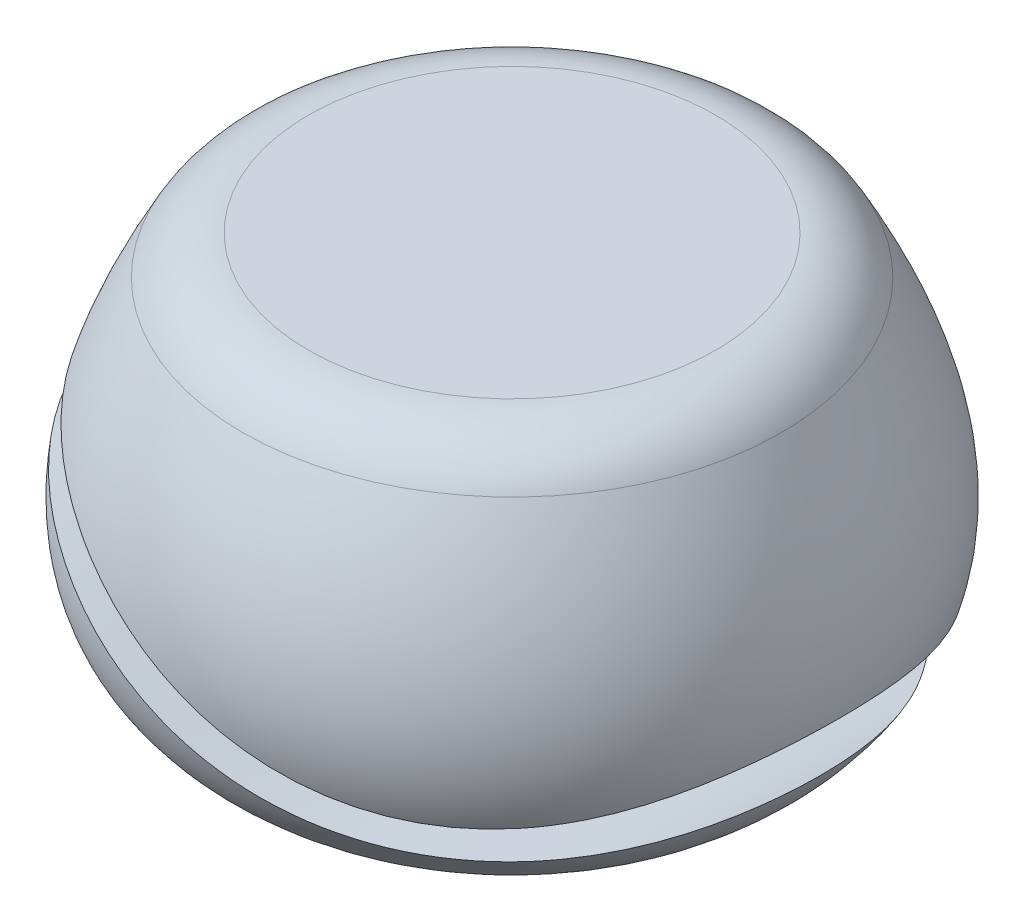
ISO-10303-21;
HEADER;
FILE_DESCRIPTION(('STEP AP214'),'2;1');
FILE_NAME('part.step','',(''),(''),'','','');
FILE_SCHEMA(('AUTOMOTIVE_DESIGN { 1 0 10303 214 1 1 1 1 }'));
ENDSEC;
DATA;
#1=APPLICATION_CONTEXT('core data for automotive mechanical design processes');
#2=APPLICATION_PROTOCOL_DEFINITION('international standard','automotive_design',2000,#1);
#3=PRODUCT_CONTEXT('',#1,'mechanical');
#4=PRODUCT('Part','Part','',(#3));
#5=PRODUCT_RELATED_PRODUCT_CATEGORY('part','',(#4));
#6=PRODUCT_DEFINITION_FORMATION('','',#4);
#7=PRODUCT_DEFINITION_CONTEXT('part definition',#1,'design');
#8=PRODUCT_DEFINITION('design','',#6,#7);
#9=PRODUCT_DEFINITION_SHAPE('','',#8);
#10=(LENGTH_UNIT() NAMED_UNIT(*) SI_UNIT(.MILLI.,.METRE.));
#11=(NAMED_UNIT(*) PLANE_ANGLE_UNIT() SI_UNIT($,.RADIAN.));
#12=(NAMED_UNIT(*) SI_UNIT($,.STERADIAN.) SOLID_ANGLE_UNIT());
#13=UNCERTAINTY_MEASURE_WITH_UNIT(LENGTH_MEASURE(1.E-05),#10,'distance_accuracy_value','');
#14=(GEOMETRIC_REPRESENTATION_CONTEXT(3) GLOBAL_UNCERTAINTY_ASSIGNED_CONTEXT((#13)) GLOBAL_UNIT_ASSIGNED_CONTEXT((#10,
#11,#12)) REPRESENTATION_CONTEXT('',''));
#15=CARTESIAN_POINT('',(0.,0.,0.));
#16=DIRECTION('',(0.,0.,1.));
#17=DIRECTION('',(1.,0.,0.));
#18=AXIS2_PLACEMENT_3D('',#15,#16,#17);
#19=CARTESIAN_POINT('',(-32.8601568198395,31.2442607099683,0.));
#20=CARTESIAN_POINT('',(-66.0245526526524,-21.9410159608166,0.));
#21=CARTESIAN_POINT('',(0.,-29.9764651818748,0.));
#22=B_SPLINE_CURVE_WITH_KNOTS('',2,(#19,#20,#21),.UNSPECIFIED.,.F.,.F.,(3,3),(0.,1.),.UNSPECIFIED.);
#23=CARTESIAN_POINT('',(0.,-36.5448515190839,0.));
#24=DIRECTION('',(0.,1.,0.));
#25=AXIS1_PLACEMENT('',#23,#24);
#26=SURFACE_OF_REVOLUTION('',#22,#25);
#27=CARTESIAN_POINT('',(0.,26.0944386957487,0.));
#28=DIRECTION('',(0.,1.,0.));
#29=DIRECTION('',(0.,0.,1.));
#30=AXIS2_PLACEMENT_3D('',#27,#28,#29);
#31=CIRCLE('',#30,35.897681248424);
#32=CARTESIAN_POINT('',(0.,26.0944386957487,35.897681248424));
#33=VERTEX_POINT('',#32);
#34=EDGE_CURVE('E66',#33,#33,#31,.F.);
#35=ORIENTED_EDGE('',*,*,#34,.T.);
#36=EDGE_LOOP('',(#35));
#37=FACE_BOUND('',#36,.T.);
#38=CARTESIAN_POINT('',(-42.2863002643115,11.3454499948039,0.));
#39=CARTESIAN_POINT('',(-42.2863003675934,11.3454498753849,0.781342153593686));
#40=CARTESIAN_POINT('',(-42.2641009291726,11.347289566309,1.56268249871241));
#41=CARTESIAN_POINT('',(-42.1754441102003,11.3544070425818,3.12283928625415));
#42=CARTESIAN_POINT('',(-42.108986204842,11.3596848686989,3.90165569863891));
#43=CARTESIAN_POINT('',(-41.932230123092,11.3729666392063,5.45425428325288));
#44=CARTESIAN_POINT('',(-41.821932738775,11.3809705343427,6.22803654618044));
#45=CARTESIAN_POINT('',(-41.5581164428658,11.3985571214034,7.76852479914471));
#46=CARTESIAN_POINT('',(-41.4045782092899,11.4081405183252,8.53522746715537));
#47=CARTESIAN_POINT('',(-41.0552032185338,11.427342559078,10.0589440176203));
#48=CARTESIAN_POINT('',(-40.8593660309374,11.4369612032665,10.8159578014016));
#49=CARTESIAN_POINT('',(-40.4265308926768,11.4543637287535,12.3180966877672));
#50=CARTESIAN_POINT('',(-40.189532709836,11.4621475997019,13.0632217232647));
#51=CARTESIAN_POINT('',(-39.5455126798731,11.4767164600585,14.9134060775395));
#52=CARTESIAN_POINT('',(-39.1131472268403,11.4810020091586,16.0097664558089));
#53=CARTESIAN_POINT('',(-38.1628953985355,11.4727166933356,18.1645713988969));
#54=CARTESIAN_POINT('',(-37.6450091987696,11.4601458630048,19.2230160415209));
#55=CARTESIAN_POINT('',(-36.5292511358058,11.4099711023646,21.2963127635235));
#56=CARTESIAN_POINT('',(-35.9313757421773,11.3723660668453,22.3111629161873));
#57=CARTESIAN_POINT('',(-34.6616059499531,11.2643178205266,24.2917725512239));
#58=CARTESIAN_POINT('',(-33.9897094967096,11.1938736980171,25.2575306698311));
#59=CARTESIAN_POINT('',(-32.7897256259158,11.0404205046081,26.8534135214824));
#60=CARTESIAN_POINT('',(-32.2787738890852,10.9674801928512,27.4974906459963));
#61=CARTESIAN_POINT('',(-31.22595832827,10.8002668642435,28.7570837739768));
#62=CARTESIAN_POINT('',(-30.684093262584,10.7059929900316,29.372598628374));
#63=CARTESIAN_POINT('',(-29.5718268729374,10.4946321259548,30.5731765199554));
#64=CARTESIAN_POINT('',(-29.0014253355125,10.3775449654182,31.1582393292791));
#65=CARTESIAN_POINT('',(-27.8344945250969,10.1195781447768,32.2960515981797));
#66=CARTESIAN_POINT('',(-27.237968276508,9.97870123339587,32.8488047809659));
#67=CARTESIAN_POINT('',(-26.0210663563107,9.67267278667662,33.9202842130726));
#68=CARTESIAN_POINT('',(-25.4006906931966,9.507521259984,34.439010474512));
#69=CARTESIAN_POINT('',(-24.1383574714087,9.15299280160851,35.4406975844311));
#70=CARTESIAN_POINT('',(-23.4964006474633,8.96361669403466,35.9236596487101));
#71=CARTESIAN_POINT('',(-22.369413233524,8.61567076255459,36.7265170955489));
#72=CARTESIAN_POINT('',(-21.8888974486699,8.46262122789267,37.0551880950254));
#73=CARTESIAN_POINT('',(-20.9183143123623,8.14433600664132,37.6919787107913));
#74=CARTESIAN_POINT('',(-20.4282463861316,7.97909958505926,38.0000970854117));
#75=CARTESIAN_POINT('',(-19.4394192760259,7.6369961968447,38.5950920393946));
#76=CARTESIAN_POINT('',(-18.9406608323507,7.46013021721501,38.8819704170176));
#77=CARTESIAN_POINT('',(-17.9350999986905,7.09539815600866,39.4339238426551));
#78=CARTESIAN_POINT('',(-17.4282968521579,6.90753103533112,39.6989968253596));
#79=CARTESIAN_POINT('',(-16.4073023031597,6.52155580405167,40.2067457245667));
#80=CARTESIAN_POINT('',(-15.8931097721501,6.32344611688965,40.4494181770185));
#81=CARTESIAN_POINT('',(-14.8580669007352,5.91790803726002,40.911736116939));
#82=CARTESIAN_POINT('',(-14.3372159101653,5.71047872972894,41.1313793361522));
#83=CARTESIAN_POINT('',(-12.7657548728746,5.07572467667634,41.7548273151972));
#84=CARTESIAN_POINT('',(-11.7059501695552,4.63582466111134,42.1232932305522));
#85=CARTESIAN_POINT('',(-9.57997294038593,3.73720436415284,42.7574686591335));
#86=CARTESIAN_POINT('',(-8.51403116065995,3.27877485916199,43.0243632600872));
#87=CARTESIAN_POINT('',(-6.90456461441876,2.58106706912359,43.3495254891194));
#88=CARTESIAN_POINT('',(-6.36624288341752,2.34678801559349,43.4453908731965));
#89=CARTESIAN_POINT('',(-5.2865794282015,1.87622442334451,43.6116849756562));
#90=CARTESIAN_POINT('',(-4.74523801941625,1.63994009279652,43.6821163021126));
#91=CARTESIAN_POINT('',(-3.66033228511002,1.16688163629346,43.7971900197923));
#92=CARTESIAN_POINT('',(-3.11676906211193,0.930107776673665,43.8418439313845));
#93=CARTESIAN_POINT('',(-2.02780692985973,0.457450686827262,43.9051642395133));
#94=CARTESIAN_POINT('',(-1.48240821620467,0.221567367050757,43.9238333223821));
#95=CARTESIAN_POINT('',(-0.390286273276154,-0.24784694309769,43.935037526026));
#96=CARTESIAN_POINT('',(0.156437033281887,-0.48137779190214,43.9275710833231));
#97=CARTESIAN_POINT('',(1.25049673335681,-0.944524665246274,43.8864606259985));
#98=CARTESIAN_POINT('',(1.79783307750994,-1.17414098379661,43.8528185862916));
#99=CARTESIAN_POINT('',(3.05554637205274,-1.6955267255905,43.7455182864422));
#100=CARTESIAN_POINT('',(3.76594815439296,-1.98544724835435,43.6629281790396));
#101=CARTESIAN_POINT('',(5.18532413137167,-2.55281645235849,43.4542614577953));
#102=CARTESIAN_POINT('',(5.89429832899095,-2.83026515966581,43.3281849348483));
#103=CARTESIAN_POINT('',(7.30935229694654,-3.36946331433419,43.0334216645284));
#104=CARTESIAN_POINT('',(8.01543210386715,-3.63121296070065,42.8647354574283));
#105=CARTESIAN_POINT('',(9.42324166840566,-4.13595123004801,42.4859866717981));
#106=CARTESIAN_POINT('',(10.1249711503252,-4.37893867494514,42.2759214980073));
#107=CARTESIAN_POINT('',(11.5225310547497,-4.84327810208579,41.816008278948));
#108=CARTESIAN_POINT('',(12.2183613872719,-5.06462975484848,41.5661596279888));
#109=CARTESIAN_POINT('',(13.6026114668156,-5.48310937239998,41.0285413883954));
#110=CARTESIAN_POINT('',(14.2910315187986,-5.68023833754981,40.7407733667929));
#111=CARTESIAN_POINT('',(15.4656996845585,-5.99607248046596,40.2157634041137));
#112=CARTESIAN_POINT('',(15.9541327188838,-6.12120229580604,39.9872065895338));
#113=CARTESIAN_POINT('',(16.9258884135259,-6.35713985998672,39.5124172226909));
#114=CARTESIAN_POINT('',(17.4092108088279,-6.46794686942254,39.2661837589031));
#115=CARTESIAN_POINT('',(18.3701019535737,-6.6746124704799,38.7568820893525));
#116=CARTESIAN_POINT('',(18.8476710593704,-6.77047199237195,38.4938149326882));
#117=CARTESIAN_POINT('',(19.7965047524699,-6.94676380174733,37.9516304310005));
#118=CARTESIAN_POINT('',(20.2677693299649,-7.0271960652331,37.6725130610113));
#119=CARTESIAN_POINT('',(21.2032867154432,-7.17225537122115,37.0990627953283));
#120=CARTESIAN_POINT('',(21.6675409364119,-7.23688563972119,36.8047330201547));
#121=CARTESIAN_POINT('',(22.588457929043,-7.35013271740377,36.2015646990053));
#122=CARTESIAN_POINT('',(23.045121324266,-7.39875084816346,35.8927273528312));
#123=CARTESIAN_POINT('',(23.9502591767768,-7.47990690932381,35.2611723924638));
#124=CARTESIAN_POINT('',(24.3987329936378,-7.51244358729354,34.9384536993119));
#125=CARTESIAN_POINT('',(25.2867024712252,-7.56151664572715,34.2797957103861));
#126=CARTESIAN_POINT('',(25.7261986281485,-7.5780539128366,33.9438571482968));
#127=CARTESIAN_POINT('',(26.7480574596003,-7.59841809928767,33.1391226894764));
#128=CARTESIAN_POINT('',(27.3264342855356,-7.59574838861574,32.66507290353));
#129=CARTESIAN_POINT('',(28.4634911221003,-7.56281651359686,31.6948661250794));
#130=CARTESIAN_POINT('',(29.0221709705424,-7.53255412210357,31.1987089506164));
#131=CARTESIAN_POINT('',(30.1177444333995,-7.44625083951016,30.1850679219707));
#132=CARTESIAN_POINT('',(30.6546384430272,-7.39021041627217,29.6675844550079));
#133=CARTESIAN_POINT('',(31.7048515325439,-7.25475921864654,28.6114337557235));
#134=CARTESIAN_POINT('',(32.2181535396278,-7.17533181835709,28.0727516900603));
#135=CARTESIAN_POINT('',(33.2185890838096,-6.99620263093733,26.9748533577255));
#136=CARTESIAN_POINT('',(33.7057225193794,-6.89650076515386,26.4156370113996));
#137=CARTESIAN_POINT('',(34.6516968045467,-6.6804488408043,25.2768095155623));
#138=CARTESIAN_POINT('',(35.110535827604,-6.56409770905475,24.6971970531691));
#139=CARTESIAN_POINT('',(36.0287975504573,-6.31026778580052,23.4765720562232));
#140=CARTESIAN_POINT('',(36.4860278934777,-6.17188133476461,22.8340969591937));
#141=CARTESIAN_POINT('',(37.3633934541936,-5.88610783731887,21.5261973188041));
#142=CARTESIAN_POINT('',(37.783527675161,-5.73872054924732,20.8607721594711));
#143=CARTESIAN_POINT('',(38.5845994554152,-5.44054146976265,19.5073986074754));
#144=CARTESIAN_POINT('',(38.9655350186675,-5.28974950545633,18.819449070198));
#145=CARTESIAN_POINT('',(39.6861119175152,-4.99045888318578,17.4222440308164));
#146=CARTESIAN_POINT('',(40.0257761576294,-4.84195899349839,16.713000621354));
#147=CARTESIAN_POINT('',(40.6624273937205,-4.55257874517914,15.2740843604993));
#148=CARTESIAN_POINT('',(40.9594153183344,-4.41169822079142,14.544411954055));
#149=CARTESIAN_POINT('',(41.5093279319344,-4.14260258408089,13.0663567106508));
#150=CARTESIAN_POINT('',(41.7622540661578,-4.01438705640285,12.3179744882983));
#151=CARTESIAN_POINT('',(42.2180888959206,-3.77763787805505,10.8204829272647));
#152=CARTESIAN_POINT('',(42.4219305868304,-3.66874956775122,10.0717141558849));
#153=CARTESIAN_POINT('',(42.7853866659625,-3.47109161046234,8.56084697706959));
#154=CARTESIAN_POINT('',(42.9449995956413,-3.38232262697527,7.79874813092559));
#155=CARTESIAN_POINT('',(43.2192940701352,-3.22785873327447,6.26417414433504));
#156=CARTESIAN_POINT('',(43.3339755850149,-3.16216383843375,5.49169899697569));
#157=CARTESIAN_POINT('',(43.5178528671765,-3.0560518400952,3.94007564200307));
#158=CARTESIAN_POINT('',(43.5870754003357,-3.01561986267993,3.16093163524436));
#159=CARTESIAN_POINT('',(43.6798422735402,-2.96130110026588,1.59900205223928));
#160=CARTESIAN_POINT('',(43.7033860424253,-2.94741464718824,0.816216430581394));
#161=CARTESIAN_POINT('',(43.7046841111772,-2.94665305231415,-0.749304548005771));
#162=CARTESIAN_POINT('',(43.6824472113037,-2.95977271922456,-1.53203988567702));
#163=CARTESIAN_POINT('',(43.6086602911234,-3.00298250803487,-2.81067445859944));
#164=CARTESIAN_POINT('',(43.5706609740804,-3.02519530114784,-3.30767922127889));
#165=CARTESIAN_POINT('',(43.4761790557516,-3.08009560528389,-4.29938797651068));
#166=CARTESIAN_POINT('',(43.4196956573005,-3.11278356806977,-4.79409186889967));
#167=CARTESIAN_POINT('',(43.2883591518857,-3.18819132880486,-5.78017430420242));
#168=CARTESIAN_POINT('',(43.2135097952134,-3.23090907861521,-6.27155350498822));
#169=CARTESIAN_POINT('',(43.0455600376172,-3.32580965689033,-7.25030623717404));
#170=CARTESIAN_POINT('',(42.9524579803051,-3.37799334433376,-7.73767940085058));
#171=CARTESIAN_POINT('',(42.7481921452671,-3.49110862506982,-8.70749116897913));
#172=CARTESIAN_POINT('',(42.6370320824603,-3.55203841880143,-9.18993076671904));
#173=CARTESIAN_POINT('',(42.3968314375864,-3.68183025362723,-10.1492609412633));
#174=CARTESIAN_POINT('',(42.2677906285371,-3.75069239541459,-10.6261514475429));
#175=CARTESIAN_POINT('',(41.9920484214221,-3.89541676215325,-11.5737509525194));
#176=CARTESIAN_POINT('',(41.8453460417483,-3.97127937612737,-12.0444596060226));
#177=CARTESIAN_POINT('',(41.5345583455908,-4.1289566062332,-12.9790553660667));
#178=CARTESIAN_POINT('',(41.3704737243043,-4.21077098428508,-13.4429427445779));
#179=CARTESIAN_POINT('',(40.9631042090047,-4.40953068839053,-14.5289647724637));
#180=CARTESIAN_POINT('',(40.7125580641328,-4.52852887990031,-15.1480142052677));
#181=CARTESIAN_POINT('',(40.1806989161772,-4.7723960826838,-16.3715226909735));
#182=CARTESIAN_POINT('',(39.8993861556575,-4.89726504766792,-16.9759818588589));
#183=CARTESIAN_POINT('',(39.3069519926139,-5.14961418949857,-18.169527424229));
#184=CARTESIAN_POINT('',(38.9958311609922,-5.27709431629779,-18.7586141158617));
#185=CARTESIAN_POINT('',(38.3446433909213,-5.53137215286004,-19.9212496296097));
#186=CARTESIAN_POINT('',(38.0045568080661,-5.65816933648299,-20.4947875534701));
#187=CARTESIAN_POINT('',(37.2968326555875,-5.90756540466642,-21.6255436053926));
#188=CARTESIAN_POINT('',(36.9291949418149,-6.03016426725617,-22.1827616480469));
#189=CARTESIAN_POINT('',(36.1676775462282,-6.26779444991824,-23.2807036421419));
#190=CARTESIAN_POINT('',(35.7737951842675,-6.38282499471026,-23.8214259007607));
#191=CARTESIAN_POINT('',(34.8963189190413,-6.61958135698465,-24.9713058953869));
#192=CARTESIAN_POINT('',(34.4084474395219,-6.73943954448338,-25.5775913337179));
#193=CARTESIAN_POINT('',(33.4017661917471,-6.95992004701663,-26.7676302823956));
#194=CARTESIAN_POINT('',(32.8829538958449,-7.06054078765544,-27.3513819454571));
#195=CARTESIAN_POINT('',(31.8169218346394,-7.23843979846526,-28.4961096810667));
#196=CARTESIAN_POINT('',(31.2697011887001,-7.3157173445091,-29.0570850466062));
#197=CARTESIAN_POINT('',(30.1494356033188,-7.44352104893181,-30.1558058352352));
#198=CARTESIAN_POINT('',(29.5763912733828,-7.49404783833964,-30.6935518060127));
#199=CARTESIAN_POINT('',(28.4069810223286,-7.56572589261427,-31.7451199600363));
#200=CARTESIAN_POINT('',(27.810615304835,-7.58687741390487,-32.2589423520791));
#201=CARTESIAN_POINT('',(26.5969630017906,-7.59797856573209,-33.2616240962403));
#202=CARTESIAN_POINT('',(25.9796764261447,-7.58792821104119,-33.7504834601772));
#203=CARTESIAN_POINT('',(24.7164340782257,-7.5351566877542,-34.7094376586775));
#204=CARTESIAN_POINT('',(24.0701780904766,-7.49191704482989,-35.1791089045114));
#205=CARTESIAN_POINT('',(22.7605494667124,-7.37180868593157,-36.0894606140629));
#206=CARTESIAN_POINT('',(22.0971761262537,-7.29493858385375,-36.5301398819936));
#207=CARTESIAN_POINT('',(20.7553321380925,-7.10793116741741,-37.3803938544805));
#208=CARTESIAN_POINT('',(20.0768612457656,-6.99779331366009,-37.7899680545686));
#209=CARTESIAN_POINT('',(18.7067703563267,-6.74525050036642,-38.5756475971737));
#210=CARTESIAN_POINT('',(18.0151518264013,-6.60284912207959,-38.9517566478723));
#211=CARTESIAN_POINT('',(16.620463410928,-6.2873147697286,-39.6681266499895));
#212=CARTESIAN_POINT('',(15.9173936853618,-6.11418222466805,-40.008388101731));
#213=CARTESIAN_POINT('',(14.5015376069466,-5.73922738609699,-40.6506207175176));
#214=CARTESIAN_POINT('',(13.7887519819291,-5.53740723105257,-40.952594732459));
#215=CARTESIAN_POINT('',(12.4020255708599,-5.12161440646558,-41.4975264353283));
#216=CARTESIAN_POINT('',(11.7285948704091,-4.90930103226784,-41.7430528595168));
#217=CARTESIAN_POINT('',(10.376062152272,-4.46410093994943,-42.1969473749074));
#218=CARTESIAN_POINT('',(9.69696037140339,-4.23121507706036,-42.4053170096912));
#219=CARTESIAN_POINT('',(8.33445539262632,-3.74744049178592,-42.7834247348085));
#220=CARTESIAN_POINT('',(7.65105232545233,-3.49655231418006,-42.9531639935125));
#221=CARTESIAN_POINT('',(6.2815101556392,-2.97962039745397,-43.2527884316977));
#222=CARTESIAN_POINT('',(5.59537198195445,-2.71358145380851,-43.3826861394908));
#223=CARTESIAN_POINT('',(4.22146937288169,-2.1691802203448,-43.6018418281668));
#224=CARTESIAN_POINT('',(3.53370489790801,-1.89081762757291,-43.6910988093647));
#225=CARTESIAN_POINT('',(2.15795038874579,-1.32480791376362,-43.8284523325238));
#226=CARTESIAN_POINT('',(1.46996035799478,-1.0371609282551,-43.8765494750336));
#227=CARTESIAN_POINT('',(-0.236878754527385,-0.315238567552095,-43.9445927083652));
#228=CARTESIAN_POINT('',(-1.25521157439849,0.122823953619208,-43.9397614280667));
#229=CARTESIAN_POINT('',(-3.28557480900425,1.00284419531919,-43.8396838471879));
#230=CARTESIAN_POINT('',(-4.29760527916866,1.44480188150673,-43.7444383429425));
#231=CARTESIAN_POINT('',(-6.31221995883615,2.32345405829846,-43.4652369942243));
#232=CARTESIAN_POINT('',(-7.31479961301741,2.76014603655657,-43.2812403981963));
#233=CARTESIAN_POINT('',(-9.3064614529264,3.61929907065041,-42.8270930777459));
#234=CARTESIAN_POINT('',(-10.295543130044,4.04175959111408,-42.5569391161693));
#235=CARTESIAN_POINT('',(-12.3011523573123,4.88320389347729,-41.9194540493637));
#236=CARTESIAN_POINT('',(-13.3168857318336,5.30115802454742,-41.5482661128639));
#237=CARTESIAN_POINT('',(-15.3255176004896,6.10497476953395,-40.7190287324328));
#238=CARTESIAN_POINT('',(-16.3184155596863,6.49083663221586,-40.2609772559721));
#239=CARTESIAN_POINT('',(-17.7867164591411,7.04054786945311,-39.5121264038544));
#240=CARTESIAN_POINT('',(-18.2726658564616,7.21894610007869,-39.2521995101219));
#241=CARTESIAN_POINT('',(-19.2370046907784,7.56543397543932,-38.7122582722861));
#242=CARTESIAN_POINT('',(-19.7153947826564,7.73352451683045,-38.4322456800294));
#243=CARTESIAN_POINT('',(-20.6639954250494,8.05883938392292,-37.8526599961567));
#244=CARTESIAN_POINT('',(-21.1342053630412,8.21606289850854,-37.5530854476732));
#245=CARTESIAN_POINT('',(-22.0656835283247,8.51917004527294,-36.9349824726));
#246=CARTESIAN_POINT('',(-22.5269522574685,8.66505431529236,-36.6164551139016));
#247=CARTESIAN_POINT('',(-23.6075017941269,8.99658584633339,-35.8406312761646));
#248=CARTESIAN_POINT('',(-24.2226144632412,9.17716565615562,-35.3753248461617));
#249=CARTESIAN_POINT('',(-25.4328946645113,9.51600503955791,-34.4118186770358));
#250=CARTESIAN_POINT('',(-26.0280616437807,9.67426399480266,-33.9136180272336));
#251=CARTESIAN_POINT('',(-27.1964406633735,9.96842087204149,-32.8858618061783));
#252=CARTESIAN_POINT('',(-27.7696528929192,10.1043189867913,-32.3563065052631));
#253=CARTESIAN_POINT('',(-28.8921741472142,10.3541854457461,-31.26730581967));
#254=CARTESIAN_POINT('',(-29.4414783020807,10.4681493381539,-30.7078543966141));
#255=CARTESIAN_POINT('',(-30.5139963023693,10.6749615789248,-29.560738082738));
#256=CARTESIAN_POINT('',(-31.0372100628149,10.7678098585177,-28.9730731000382));
#257=CARTESIAN_POINT('',(-32.0554494597575,10.9336559589441,-27.7711883390099));
#258=CARTESIAN_POINT('',(-32.5504750316024,11.0066537342502,-27.1569684997812));
#259=CARTESIAN_POINT('',(-33.7580874398781,11.1673869007138,-25.58001086102));
#260=CARTESIAN_POINT('',(-34.4511383727579,11.2432920481846,-24.600971661894));
#261=CARTESIAN_POINT('',(-35.7609325605504,11.3601907931339,-22.5912434257652));
#262=CARTESIAN_POINT('',(-36.3776742925074,11.4011836939405,-21.5605533585066));
#263=CARTESIAN_POINT('',(-37.5285405094331,11.4564690271714,-19.4532031909773));
#264=CARTESIAN_POINT('',(-38.0626560625153,11.4707585748117,-18.3765381368427));
#265=CARTESIAN_POINT('',(-39.0422423439366,11.4812954554067,-16.1834071470912));
#266=CARTESIAN_POINT('',(-39.4877146268323,11.4775431047952,-15.0669419098639));
#267=CARTESIAN_POINT('',(-40.1481067591068,11.4633565498704,-13.1893167117401));
#268=CARTESIAN_POINT('',(-40.3897369812393,11.4556507014059,-12.4374174127977));
#269=CARTESIAN_POINT('',(-40.8310662191154,11.4382652081833,-10.9213850844721));
#270=CARTESIAN_POINT('',(-41.0307656105741,11.4285855811126,-10.1572521647724));
#271=CARTESIAN_POINT('',(-41.3870522301966,11.4091927919644,-8.61900994234524));
#272=CARTESIAN_POINT('',(-41.5436397948698,11.3994796301493,-7.84490071753727));
#273=CARTESIAN_POINT('',(-41.8126910587262,11.3816255900315,-6.28946175209228));
#274=CARTESIAN_POINT('',(-41.9251790300711,11.3734838480847,-5.50813622634872));
#275=CARTESIAN_POINT('',(-42.1054506707541,11.3599624643284,-3.94030351059979));
#276=CARTESIAN_POINT('',(-42.1732336519323,11.3545828650378,-3.15379624101818));
#277=CARTESIAN_POINT('',(-42.2636577755969,11.3473267387649,-1.57819198487997));
#278=CARTESIAN_POINT('',(-42.2863001600048,11.3454501154078,-0.789095070168771));
#279=CARTESIAN_POINT('',(-42.2863002643115,11.3454499948039,0.));
#280=B_SPLINE_CURVE_WITH_KNOTS('',3,(#38,#39,#40,#41,#42,#43,#44,#45,#46,#47,#48,#49,#50,#51,
#52,#53,#54,#55,#56,#57,#58,#59,#60,#61,#62,#63,#64,#65,#66,#67,#68,#69,#70,#71,#72,#73,#74,#75,
#76,#77,#78,#79,#80,#81,#82,#83,#84,#85,#86,#87,#88,#89,#90,#91,#92,#93,#94,#95,#96,#97,#98,#99,
#100,#101,#102,#103,#104,#105,#106,#107,#108,#109,#110,#111,#112,#113,#114,#115,#116,#117,#118,
#119,#120,#121,#122,#123,#124,#125,#126,#127,#128,#129,#130,#131,#132,#133,#134,#135,#136,#137,
#138,#139,#140,#141,#142,#143,#144,#145,#146,#147,#148,#149,#150,#151,#152,#153,#154,#155,#156,
#157,#158,#159,#160,#161,#162,#163,#164,#165,#166,#167,#168,#169,#170,#171,#172,#173,#174,#175,
#176,#177,#178,#179,#180,#181,#182,#183,#184,#185,#186,#187,#188,#189,#190,#191,#192,#193,#194,
#195,#196,#197,#198,#199,#200,#201,#202,#203,#204,#205,#206,#207,#208,#209,#210,#211,#212,#213,
#214,#215,#216,#217,#218,#219,#220,#221,#222,#223,#224,#225,#226,#227,#228,#229,#230,#231,#232,
#233,#234,#235,#236,#237,#238,#239,#240,#241,#242,#243,#244,#245,#246,#247,#248,#249,#250,#251,
#252,#253,#254,#255,#256,#257,#258,#259,#260,#261,#262,#263,#264,#265,#266,#267,#268,#269,#270,
#271,#272,#273,#274,#275,#276,#277,#278,#279),.UNSPECIFIED.,.T.,.F.,(4,2,2,2,2,2,2,2,2,2,2,2,2,
2,2,2,2,2,2,2,2,2,2,2,2,2,2,2,2,2,2,2,2,2,2,2,2,2,2,2,2,2,2,2,2,2,2,2,2,2,2,2,2,2,2,2,2,2,2,2,2,
2,2,2,2,2,2,2,2,2,2,2,2,2,2,2,2,2,2,2,2,2,2,2,2,2,2,2,2,2,2,2,2,2,2,2,2,2,2,2,2,2,2,2,2,2,2,2,2,
2,2,2,2,2,2,2,2,2,2,2,4),(0.,2.34370688780692,4.68744156724409,7.03113390291775,
9.37587517340946,11.7206403041137,14.0654186613571,17.5969335509061,21.1284411931576,
24.6601047547081,28.1918663715264,30.6667233145165,33.141679735643,35.6166546732207,
38.0913438417705,40.5660321289256,43.0406362507081,44.8459742327488,46.6514211841156,
48.4567151041378,50.2621798171531,52.0679232637632,53.8738443996318,57.4846751213219,
61.0519808989478,62.8361189620946,64.6200740231463,66.403231185603,68.1862039901532,
69.9692834574201,71.7522284067004,74.0660054890485,76.379777735204,78.6935206451773,
81.0074087177615,83.3213320219215,85.6351597323465,87.295474481803,88.9558749096375,
90.6161719596595,92.2764715923023,93.9364319890723,95.5962553450624,97.2562079484959,
98.9160685564194,101.158396223988,103.400742350841,105.643047781513,107.88695114131,
110.130863206314,112.374919975297,114.775527571634,117.17619964978,119.576993912103,
121.976449650331,124.375853168473,126.775177970771,129.124471717014,131.473842927326,
133.823215702894,136.171203943753,138.519221543304,140.866787833693,142.363225485398,
143.859727682677,145.355924551176,146.8522572588,148.348282527617,149.84432678906,
151.34045423721,152.836521870808,154.870615142467,156.904692378495,158.938730664429,
160.974159578469,163.009599142732,165.045246888943,167.406198589668,169.767343428423,
172.128561504522,174.489723878891,176.850865641974,179.212006287178,181.610802139344,
184.00969686894,186.408630495977,188.807297971851,191.20593196523,193.604387250445,
195.845902457281,198.08732452452,200.328678791242,202.56932753215,204.810031385795,
207.05070254556,210.372412595448,213.694093389215,217.017300842535,220.340633172036,
223.814928031745,227.289304196892,229.026663584051,230.76387162495,232.50120919148,
234.238448960697,236.613551430055,238.988719681902,241.363867458164,243.739496790208,
246.115133859191,248.490776376686,252.092201732273,255.693698952416,259.29558522261,
262.897408320161,265.265744516222,267.634059490256,270.002355977883,272.369347132598,
274.73637472241,277.10333718896),.UNSPECIFIED.);
#281=CARTESIAN_POINT('',(-42.2863002643115,11.3454499948039,0.));
#282=VERTEX_POINT('',#281);
#283=EDGE_CURVE('E61',#282,#282,#280,.T.);
#284=ORIENTED_EDGE('',*,*,#283,.T.);
#285=EDGE_LOOP('',(#284));
#286=FACE_BOUND('',#285,.T.);
#287=ADVANCED_FACE('F51',(#37,#286),#26,.F.);
#288=CARTESIAN_POINT('',(0.,31.2442607099683,0.));
#289=DIRECTION('',(0.,1.,0.));
#290=DIRECTION('',(0.,0.,1.));
#291=AXIS2_PLACEMENT_3D('',#288,#289,#290);
#292=PLANE('',#291);
#293=CARTESIAN_POINT('',(0.,31.2442607099683,0.));
#294=DIRECTION('',(0.,1.,0.));
#295=DIRECTION('',(0.,0.,1.));
#296=AXIS2_PLACEMENT_3D('',#293,#294,#295);
#297=CIRCLE('',#296,27.1526384522879);
#298=CARTESIAN_POINT('',(0.,31.2442607099683,27.1526384522879));
#299=VERTEX_POINT('',#298);
#300=EDGE_CURVE('E11',#299,#299,#297,.T.);
#301=ORIENTED_EDGE('',*,*,#300,.T.);
#302=EDGE_LOOP('',(#301));
#303=FACE_BOUND('',#302,.T.);
#304=ADVANCED_FACE('F83',(#303),#292,.T.);
#305=CARTESIAN_POINT('',(0.,21.2442607099683,0.));
#306=DIRECTION('',(0.,1.,0.));
#307=DIRECTION('',(0.,0.,1.));
#308=AXIS2_PLACEMENT_3D('',#305,#306,#307);
#309=TOROIDAL_SURFACE('',#308,27.1526384522879,10.);
#310=ORIENTED_EDGE('',*,*,#34,.F.);
#311=EDGE_LOOP('',(#310));
#312=FACE_BOUND('',#311,.T.);
#313=ORIENTED_EDGE('',*,*,#300,.F.);
#314=EDGE_LOOP('',(#313));
#315=FACE_BOUND('',#314,.T.);
#316=ADVANCED_FACE('F81',(#312,#315),#309,.T.);
#317=CARTESIAN_POINT('',(-69.277469966941,-6.47148377102412,0.));
#318=CARTESIAN_POINT('',(-25.1471690410937,41.2236250733039,0.));
#319=CARTESIAN_POINT('',(14.801469396763,-45.1132709065495,0.));
#320=CARTESIAN_POINT('',(59.0827921122741,6.50356077127922,0.));
#321=B_SPLINE_CURVE_WITH_KNOTS('',3,(#317,#318,#319,#320),.UNSPECIFIED.,.F.,.F.,(4,4),(0.,1.),.UNSPECIFIED.);
#322=DIRECTION('',(0.,0.,1.));
#323=VECTOR('',#322,1.);
#324=SURFACE_OF_LINEAR_EXTRUSION('',#321,#323);
#325=OFFSET_SURFACE('',#324,-3.,.F.);
#326=ORIENTED_EDGE('',*,*,#283,.F.);
#327=EDGE_LOOP('',(#326));
#328=FACE_BOUND('',#327,.T.);
#329=ADVANCED_FACE('F77',(#328),#325,.T.);
#330=CLOSED_SHELL('',(#287,#304,#316,#329));
#331=MANIFOLD_SOLID_BREP('B2',#330);
#332=CARTESIAN_POINT('',(-32.8601568198395,31.2442607099683,0.));
#333=CARTESIAN_POINT('',(-66.0245526526524,-21.9410159608166,0.));
#334=CARTESIAN_POINT('',(0.,-29.9764651818748,0.));
#335=B_SPLINE_CURVE_WITH_KNOTS('',2,(#332,#333,#334),.UNSPECIFIED.,.F.,.F.,(3,3),(0.,1.),.UNSPECIFIED.);
#336=CARTESIAN_POINT('',(0.,-36.5448515190839,0.));
#337=DIRECTION('',(0.,1.,0.));
#338=AXIS1_PLACEMENT('',#336,#337);
#339=SURFACE_OF_REVOLUTION('',#335,#338);
#340=CARTESIAN_POINT('',(-43.6338978635399,5.1622015610387,0.));
#341=CARTESIAN_POINT('',(-43.633900038238,5.1621978566875,0.802853343712937));
#342=CARTESIAN_POINT('',(-43.6112974133774,5.16538331012246,1.60566965222914));
#343=CARTESIAN_POINT('',(-43.5209984814071,5.17780555059268,3.2088645884619));
#344=CARTESIAN_POINT('',(-43.4532947440867,5.18704333471877,4.00924279268176));
#345=CARTESIAN_POINT('',(-43.2731179440903,5.21065352972956,5.60487964407559));
#346=CARTESIAN_POINT('',(-43.1606436760982,5.22502607885176,6.4001381528309));
#347=CARTESIAN_POINT('',(-42.8913396792414,5.25742669224561,7.98386787878627));
#348=CARTESIAN_POINT('',(-42.7344644080416,5.27545850443953,8.7723312660578));
#349=CARTESIAN_POINT('',(-42.3771528809833,5.31315882100246,10.3392658769853));
#350=CARTESIAN_POINT('',(-42.1767179318,5.33282727626557,11.1177373996292));
#351=CARTESIAN_POINT('',(-41.7332383613463,5.37135621838581,12.6624131437086));
#352=CARTESIAN_POINT('',(-41.4901936295272,5.39021670314654,13.4286173333118));
#353=CARTESIAN_POINT('',(-40.8287944769129,5.43302558987846,15.3314539763791));
#354=CARTESIAN_POINT('',(-40.3840099210829,5.45470994519035,16.4590703334301));
#355=CARTESIAN_POINT('',(-39.4044791242789,5.47960301988399,18.6745966102601));
#356=CARTESIAN_POINT('',(-38.8697318081803,5.48281151844883,19.7625060553217));
#357=CARTESIAN_POINT('',(-37.7153230491312,5.4600564651928,21.8918923308612));
#358=CARTESIAN_POINT('',(-37.0956840272983,5.43410060310582,22.9333813257042));
#359=CARTESIAN_POINT('',(-36.1070227594009,5.3658724712408,24.4555141238684));
#360=CARTESIAN_POINT('',(-35.7675547448393,5.33824197055961,24.9562696641661));
#361=CARTESIAN_POINT('',(-35.069624898604,5.27212416871305,25.9436119100127));
#362=CARTESIAN_POINT('',(-34.7111643782238,5.23363761628732,26.4301995901634));
#363=CARTESIAN_POINT('',(-33.8469132797525,5.12920194607057,27.5566398418602));
#364=CARTESIAN_POINT('',(-33.3335979048743,5.05835494375638,28.1902945280773));
#365=CARTESIAN_POINT('',(-32.2758650890139,4.89298968757129,29.427881424504));
#366=CARTESIAN_POINT('',(-31.7314467684024,4.79847076397348,30.0318127932019));
#367=CARTESIAN_POINT('',(-30.6137140657409,4.5843070764941,31.207674672932));
#368=CARTESIAN_POINT('',(-30.0403993275604,4.46466200289069,31.7796047893852));
#369=CARTESIAN_POINT('',(-28.8673286255564,4.1994395678931,32.8889876647773));
#370=CARTESIAN_POINT('',(-28.2675801359442,4.05386950190628,33.426450065363));
#371=CARTESIAN_POINT('',(-27.0438084443492,3.73657089262287,34.4647720687537));
#372=CARTESIAN_POINT('',(-26.4197852170333,3.56484232202678,34.9656316333585));
#373=CARTESIAN_POINT('',(-25.1497813144914,3.19565155301249,35.9284697622538));
#374=CARTESIAN_POINT('',(-24.5038027114029,2.99819177813505,36.3904519815427));
#375=CARTESIAN_POINT('',(-23.3976137808992,2.64432011447665,37.1350553893205));
#376=CARTESIAN_POINT('',(-22.9425831654646,2.49442001627672,37.428536891952));
#377=CARTESIAN_POINT('',(-22.0238877775925,2.18345874172405,37.9954849753567));
#378=CARTESIAN_POINT('',(-21.5602225443053,2.02239696839101,38.268950483967));
#379=CARTESIAN_POINT('',(-20.6250549748123,1.68975042607041,38.7951381929839));
#380=CARTESIAN_POINT('',(-20.1535536478118,1.51816700461957,39.0478630400505));
#381=CARTESIAN_POINT('',(-19.203282357301,1.16515626625388,39.5319985636641));
#382=CARTESIAN_POINT('',(-18.7245116916109,0.983727993965294,39.7634071657198));
#383=CARTESIAN_POINT('',(-17.7605095582109,0.611898136482822,40.2042285922145));
#384=CARTESIAN_POINT('',(-17.2752794672293,0.421498442118035,40.4136460217683));
#385=CARTESIAN_POINT('',(-16.2988601652591,0.0325799507590683,40.8099897170314));
#386=CARTESIAN_POINT('',(-15.8076703509822,-0.165939673100781,40.9969136845164));
#387=CARTESIAN_POINT('',(-14.8200599773459,-0.570072087549335,41.3476977601201));
#388=CARTESIAN_POINT('',(-14.3236400066328,-0.775684085701864,41.5115604345678));
#389=CARTESIAN_POINT('',(-13.326143526167,-1.19295499697283,41.8157751307074));
#390=CARTESIAN_POINT('',(-12.8250665839376,-1.40461447556303,41.956124945344));
#391=CARTESIAN_POINT('',(-11.3517541456274,-2.03167936726075,42.3320526987496));
#392=CARTESIAN_POINT('',(-10.3738762219346,-2.45385305761815,42.5351089350308));
#393=CARTESIAN_POINT('',(-8.40784767862047,-3.30780067632129,42.8497443300178));
#394=CARTESIAN_POINT('',(-7.41969746141532,-3.73957422934232,42.9613270586157));
#395=CARTESIAN_POINT('',(-5.43794731222892,-4.60347730355207,43.0919944235683));
#396=CARTESIAN_POINT('',(-4.44435003997824,-5.035606576268,43.1111207672495));
#397=CARTESIAN_POINT('',(-2.4559241916048,-5.89117299607059,43.0574385308016));
#398=CARTESIAN_POINT('',(-1.46109561915334,-6.31461016900807,42.9846302241317));
#399=CARTESIAN_POINT('',(0.516229545629573,-7.14009347769678,42.7503125165561));
#400=CARTESIAN_POINT('',(1.49875613024822,-7.54229884241104,42.5896139280096));
#401=CARTESIAN_POINT('',(3.45633411570225,-8.32136373413369,42.1837976629429));
#402=CARTESIAN_POINT('',(4.43138558431181,-8.69822349118291,41.9386807527407));
#403=CARTESIAN_POINT('',(6.37048029742211,-9.41965443265116,41.3690617333017));
#404=CARTESIAN_POINT('',(7.33452004525274,-9.76421559823247,41.0445351035898));
#405=CARTESIAN_POINT('',(9.24794404258167,-10.4150578491871,40.3222467603035));
#406=CARTESIAN_POINT('',(10.1973276697278,-10.7213373128778,39.9244819459901));
#407=CARTESIAN_POINT('',(12.1248184837856,-11.305037666013,39.0411112987869));
#408=CARTESIAN_POINT('',(13.1020370990784,-11.5802939902542,38.5521437855466));
#409=CARTESIAN_POINT('',(15.0342035545402,-12.0797828945503,37.5084403433785));
#410=CARTESIAN_POINT('',(15.9891507145628,-12.3040139181737,36.9537024090316));
#411=CARTESIAN_POINT('',(17.4026860918903,-12.6003728251856,36.0775412566909));
#412=CARTESIAN_POINT('',(17.8708792092688,-12.6925200276677,35.7780314510945));
#413=CARTESIAN_POINT('',(18.8005602670104,-12.8633267288746,35.1650992808951));
#414=CARTESIAN_POINT('',(19.2620486333309,-12.9419870878876,34.8516778052857));
#415=CARTESIAN_POINT('',(20.1779584290939,-13.085751673765,34.2116060752558));
#416=CARTESIAN_POINT('',(20.632379242516,-13.15085472501,33.8849546765364));
#417=CARTESIAN_POINT('',(21.5336511974302,-13.2675210378317,33.2190866005944));
#418=CARTESIAN_POINT('',(21.9805025722481,-13.3190847174686,32.8798703117117));
#419=CARTESIAN_POINT('',(23.0924763370716,-13.4317010831442,32.0129685027949));
#420=CARTESIAN_POINT('',(23.7524718298104,-13.4841417159578,31.4775391658534));
#421=CARTESIAN_POINT('',(25.0522143095913,-13.5591853111761,30.3805945827078));
#422=CARTESIAN_POINT('',(25.6919595411119,-13.5817856935674,29.8190770852435));
#423=CARTESIAN_POINT('',(26.9489052344327,-13.5985540226339,28.6708303376123));
#424=CARTESIAN_POINT('',(27.5661037214228,-13.5927194847561,28.0840988887701));
#425=CARTESIAN_POINT('',(28.7754102793261,-13.554644049227,26.8856294099614));
#426=CARTESIAN_POINT('',(29.3675073373337,-13.5223916846785,26.2738806305678));
#427=CARTESIAN_POINT('',(30.5230807598431,-13.4342173096271,25.0256549803303));
#428=CARTESIAN_POINT('',(31.0865597296186,-13.3782974580569,24.3891803697687));
#429=CARTESIAN_POINT('',(32.1812742206198,-13.246285329803,23.0911640998609));
#430=CARTESIAN_POINT('',(32.7125133616557,-13.1701953229445,22.4296252682627));
#431=CARTESIAN_POINT('',(33.6594231868245,-13.0151063661307,21.1852094759705));
#432=CARTESIAN_POINT('',(34.0802648042729,-12.9383750822386,20.6059796215601));
#433=CARTESIAN_POINT('',(34.8934104546801,-12.7765393951561,19.4289799100973));
#434=CARTESIAN_POINT('',(35.2857166711265,-12.6914356337905,18.8312114765933));
#435=CARTESIAN_POINT('',(36.0391093375982,-12.5161501367105,17.6169315416989));
#436=CARTESIAN_POINT('',(36.4001931768784,-12.425967977391,17.0004184787393));
#437=CARTESIAN_POINT('',(37.0876355025204,-12.2442746693349,15.7500557411457));
#438=CARTESIAN_POINT('',(37.4140600854525,-12.1527664426999,15.1162420721641));
#439=CARTESIAN_POINT('',(38.0301949359496,-11.9719497571151,13.8307039011283));
#440=CARTESIAN_POINT('',(38.3199069127163,-11.8826411959132,13.1789802346169));
#441=CARTESIAN_POINT('',(38.859906077746,-11.7099482214691,11.85872708565));
#442=CARTESIAN_POINT('',(39.1102018822442,-11.6265625157056,11.19020131323));
#443=CARTESIAN_POINT('',(39.5246278926787,-11.4844564160029,9.9685028542891));
#444=CARTESIAN_POINT('',(39.6960630227251,-11.4240829210015,9.41799300630239));
#445=CARTESIAN_POINT('',(40.0105263106006,-11.3112205372209,8.30813473493753));
#446=CARTESIAN_POINT('',(40.1535565681967,-11.2587310657029,7.74878696818535));
#447=CARTESIAN_POINT('',(40.4101936734644,-11.1631655721322,6.62259777187675));
#448=CARTESIAN_POINT('',(40.5238017283302,-11.1200891638724,6.05575665077632));
#449=CARTESIAN_POINT('',(40.7207345113939,-11.044634431734,4.91630076972264));
#450=CARTESIAN_POINT('',(40.804068673652,-11.0122527754044,4.34368786565836));
#451=CARTESIAN_POINT('',(40.9398753027379,-10.9591395661694,3.19423264450592));
#452=CARTESIAN_POINT('',(40.9923459380765,-10.9384087046433,2.61739007847921));
#453=CARTESIAN_POINT('',(41.0660121023488,-10.9092284338079,1.46140846142609));
#454=CARTESIAN_POINT('',(41.0872082911237,-10.9007787653849,0.882269459109352));
#455=CARTESIAN_POINT('',(41.0981709272303,-10.896414046909,-0.277268554488386));
#456=CARTESIAN_POINT('',(41.0878877192792,-10.9005188000649,-0.857668111843911));
#457=CARTESIAN_POINT('',(41.0358634935812,-10.9211807784171,-2.01684364751294));
#458=CARTESIAN_POINT('',(40.994121691296,-10.9377383141703,-2.59561958497406));
#459=CARTESIAN_POINT('',(40.8795074325092,-10.9828004516345,-3.7495689584827));
#460=CARTESIAN_POINT('',(40.8066368604949,-11.0113043301305,-4.32474261046859));
#461=CARTESIAN_POINT('',(40.6303017253073,-11.0794060633459,-5.46985262529212));
#462=CARTESIAN_POINT('',(40.5268294887845,-11.1190067004402,-6.03978763754188));
#463=CARTESIAN_POINT('',(40.2900647585709,-11.2081188677408,-7.17265869521691));
#464=CARTESIAN_POINT('',(40.1567709467182,-11.2576308360339,-7.73559443010141));
#465=CARTESIAN_POINT('',(39.8613270370521,-11.3651097529456,-8.85303643206011));
#466=CARTESIAN_POINT('',(39.6991747677841,-11.4230773377478,-9.40754206140072));
#467=CARTESIAN_POINT('',(39.3062324218124,-11.5600581806727,-10.6346374365197));
#468=CARTESIAN_POINT('',(39.0682481028367,-11.6408321827768,-11.3047341233137));
#469=CARTESIAN_POINT('',(38.5524986907036,-11.8092553921329,-12.6286476982791));
#470=CARTESIAN_POINT('',(38.2747249862226,-11.8969060857944,-13.2824610263138));
#471=CARTESIAN_POINT('',(37.6820194241868,-12.0754295781838,-14.5725522857399));
#472=CARTESIAN_POINT('',(37.3670864192625,-12.1663024763431,-15.2088296749246));
#473=CARTESIAN_POINT('',(36.7021073551412,-12.3477867404447,-16.4644582183432));
#474=CARTESIAN_POINT('',(36.3519903757991,-12.4383971834368,-17.0837718485269));
#475=CARTESIAN_POINT('',(35.6199796077381,-12.6155849785691,-18.3038262995932));
#476=CARTESIAN_POINT('',(35.2380880228417,-12.7021626097683,-18.9045684046019));
#477=CARTESIAN_POINT('',(34.4452031838452,-12.8679525621636,-20.0876333632694));
#478=CARTESIAN_POINT('',(34.0342064867575,-12.9471640094051,-20.6699540259376));
#479=CARTESIAN_POINT('',(33.0711404986948,-13.1151466800288,-21.9712420806255));
#480=CARTESIAN_POINT('',(32.5109542254878,-13.200720028896,-22.6846288228486));
#481=CARTESIAN_POINT('',(31.3528788390792,-13.3496164766721,-24.082678340163));
#482=CARTESIAN_POINT('',(30.754982843124,-13.4129354997941,-24.7673358334137));
#483=CARTESIAN_POINT('',(29.5260162989895,-13.5129012961802,-26.1083501517828));
#484=CARTESIAN_POINT('',(28.894942407258,-13.549545375691,-26.7647041123913));
#485=CARTESIAN_POINT('',(27.6033785859107,-13.5927283470739,-28.0493408008159));
#486=CARTESIAN_POINT('',(26.9428773631276,-13.599255578921,-28.6776125631315));
#487=CARTESIAN_POINT('',(25.5961143467205,-13.5796635791418,-29.9052578498392));
#488=CARTESIAN_POINT('',(24.9098549316083,-13.5535473546543,-30.5046340308304));
#489=CARTESIAN_POINT('',(23.5143299614991,-13.4669950414142,-31.6734006451813));
#490=CARTESIAN_POINT('',(22.805064257595,-13.4065587304847,-32.2427908843956));
#491=CARTESIAN_POINT('',(21.3627118300603,-13.250088029676,-33.3521793565881));
#492=CARTESIAN_POINT('',(20.6295343975579,-13.1538989201885,-33.892037968915));
#493=CARTESIAN_POINT('',(19.1442929791781,-12.9256855225874,-34.937153760842));
#494=CARTESIAN_POINT('',(18.3922286939761,-12.7936606662121,-35.4424103915857));
#495=CARTESIAN_POINT('',(16.8708859372158,-12.4941368078384,-36.4152280423594));
#496=CARTESIAN_POINT('',(16.1016065169614,-12.3266358464869,-36.8827869783672));
#497=CARTESIAN_POINT('',(14.5482352071901,-11.9573429208555,-37.7761116513129));
#498=CARTESIAN_POINT('',(13.764159360282,-11.7555863898693,-38.2019198635987));
#499=CARTESIAN_POINT('',(12.182007148013,-11.3192873790343,-39.0083258145999));
#500=CARTESIAN_POINT('',(11.3839313023418,-11.0847461139353,-39.3889252274393));
#501=CARTESIAN_POINT('',(9.77547240769279,-10.5851589674715,-40.1007823899174));
#502=CARTESIAN_POINT('',(8.96509069408759,-10.3201163757164,-40.4320454517246));
#503=CARTESIAN_POINT('',(7.3962569568913,-9.78380947611859,-41.0178828094965));
#504=CARTESIAN_POINT('',(6.63857768466025,-9.51457405269896,-41.2763861772135));
#505=CARTESIAN_POINT('',(5.11587735306749,-8.95542080036483,-41.7448886311535));
#506=CARTESIAN_POINT('',(4.3508564866041,-8.66550351357975,-41.9548889881648));
#507=CARTESIAN_POINT('',(2.81528371083466,-8.06827409109363,-42.3237412504871));
#508=CARTESIAN_POINT('',(2.04473186504281,-7.76096215486336,-42.4825937421897));
#509=CARTESIAN_POINT('',(0.500571279275281,-7.13284818088482,-42.7469072907677));
#510=CARTESIAN_POINT('',(-0.273035107504322,-6.8120551804466,-42.8524035167097));
#511=CARTESIAN_POINT('',(-1.8217508239245,-6.16079769923012,-43.0085817790175));
#512=CARTESIAN_POINT('',(-2.59686018332668,-5.83033302507059,-43.0592627186033));
#513=CARTESIAN_POINT('',(-4.14624011172698,-5.16405533112867,-43.1048622106892));
#514=CARTESIAN_POINT('',(-4.92051078916583,-4.82824312159179,-43.0997891321194));
#515=CARTESIAN_POINT('',(-6.70383811630761,-4.0521330368962,-43.023351015589));
#516=CARTESIAN_POINT('',(-7.71193321326573,-3.61143618216268,-42.932095005471));
#517=CARTESIAN_POINT('',(-9.71821175620539,-2.73800041025847,-42.6544274513884));
#518=CARTESIAN_POINT('',(-10.7163961328966,-2.30526074251843,-42.4680249304081));
#519=CARTESIAN_POINT('',(-12.6984136474778,-1.45687775849419,-42.0022076388788));
#520=CARTESIAN_POINT('',(-13.6822447677675,-1.04123683107365,-41.722779921038));
#521=CARTESIAN_POINT('',(-15.6306210944647,-0.235660510016202,-41.0741789517022));
#522=CARTESIAN_POINT('',(-16.5951660853735,0.154274596501501,-40.705004698006));
#523=CARTESIAN_POINT('',(-18.4767188087642,0.891752139216359,-39.8910584071469));
#524=CARTESIAN_POINT('',(-19.3943122483589,1.24010443250424,-39.4483815180628));
#525=CARTESIAN_POINT('',(-20.7498093734129,1.73458974604218,-38.7265463252079));
#526=CARTESIAN_POINT('',(-21.1982104515198,1.89476130659713,-38.4762655166278));
#527=CARTESIAN_POINT('',(-22.0875112894743,2.20520906478785,-37.9569692145337));
#528=CARTESIAN_POINT('',(-22.5284117190216,2.35548614933313,-37.6879554046468));
#529=CARTESIAN_POINT('',(-23.4019823645789,2.64560781509894,-37.1318546632379));
#530=CARTESIAN_POINT('',(-23.834654755122,2.78545518208815,-36.8447725957804));
#531=CARTESIAN_POINT('',(-24.6912341135466,3.05436232087833,-36.2531004856856));
#532=CARTESIAN_POINT('',(-25.1151418500301,3.18342304164208,-35.9485119871763));
#533=CARTESIAN_POINT('',(-25.9536245826957,3.4304936943412,-35.3224008016509));
#534=CARTESIAN_POINT('',(-26.3681988384318,3.54850275185352,-35.0008767778116));
#535=CARTESIAN_POINT('',(-27.1872975839716,3.77327824655393,-34.3415808970388));
#536=CARTESIAN_POINT('',(-27.5918226350615,3.88004531273344,-34.0038099506655));
#537=CARTESIAN_POINT('',(-28.5294745436567,4.11756191570418,-33.1920679047339));
#538=CARTESIAN_POINT('',(-29.0582437402742,4.24368747450524,-32.7116831604501));
#539=CARTESIAN_POINT('',(-30.0947493494883,4.47557576618521,-31.7240896280598));
#540=CARTESIAN_POINT('',(-30.6024854990418,4.58133824446005,-31.2168805046633));
#541=CARTESIAN_POINT('',(-31.5953433087358,4.77309702602432,-30.1772406407016));
#542=CARTESIAN_POINT('',(-32.0804653538335,4.85909366588331,-29.6448103297851));
#543=CARTESIAN_POINT('',(-33.0267917070349,5.01233120077137,-28.5560434299247));
#544=CARTESIAN_POINT('',(-33.487983578601,5.07956242131856,-27.9996946798016));
#545=CARTESIAN_POINT('',(-34.3846976086357,5.19653374701964,-26.8649047478574));
#546=CARTESIAN_POINT('',(-34.8202196376446,5.24627376396715,-26.286463454642));
#547=CARTESIAN_POINT('',(-35.6641528983343,5.32990106038245,-25.1090639468414));
#548=CARTESIAN_POINT('',(-36.0725635172829,5.36378798166655,-24.510105269016));
#549=CARTESIAN_POINT('',(-37.0900142373853,5.43321601885862,-22.9395226704912));
#550=CARTESIAN_POINT('',(-37.6777853105721,5.45828327656447,-21.9535314147611));
#551=CARTESIAN_POINT('',(-38.7772835407193,5.48190913636139,-19.9397876047519));
#552=CARTESIAN_POINT('',(-39.289005338547,5.48046587116881,-18.9120321138726));
#553=CARTESIAN_POINT('',(-40.2319249123101,5.46013308761028,-16.8208522102588));
#554=CARTESIAN_POINT('',(-40.6631530167668,5.44125015620013,-15.7574414106532));
#555=CARTESIAN_POINT('',(-41.4414989246984,5.39495301091545,-13.6005438590021));
#556=CARTESIAN_POINT('',(-41.7886267389688,5.36753981332106,-12.5070607038614));
#557=CARTESIAN_POINT('',(-42.3467681260742,5.31668454643665,-10.4742929165794));
#558=CARTESIAN_POINT('',(-42.5706987960742,5.29331382362223,-9.5385314156764));
#559=CARTESIAN_POINT('',(-42.9556816939762,5.25019294638381,-7.65414463888513));
#560=CARTESIAN_POINT('',(-43.1167411593915,5.23044237535953,-6.70552085667454));
#561=CARTESIAN_POINT('',(-43.3748598464868,5.19758510248551,-4.79970790405934));
#562=CARTESIAN_POINT('',(-43.471933212514,5.18447693245842,-3.84252067408406));
#563=CARTESIAN_POINT('',(-43.6014552625669,5.16678680733224,-1.92353831588594));
#564=CARTESIAN_POINT('',(-43.6338952584566,5.16220599850208,-0.961742585596089));
#565=CARTESIAN_POINT('',(-43.6338978635399,5.1622015610387,0.));
#566=B_SPLINE_CURVE_WITH_KNOTS('',3,(#340,#341,#342,#343,#344,#345,#346,#347,#348,#349,#350,
#351,#352,#353,#354,#355,#356,#357,#358,#359,#360,#361,#362,#363,#364,#365,#366,#367,#368,#369,
#370,#371,#372,#373,#374,#375,#376,#377,#378,#379,#380,#381,#382,#383,#384,#385,#386,#387,#388,
#389,#390,#391,#392,#393,#394,#395,#396,#397,#398,#399,#400,#401,#402,#403,#404,#405,#406,#407,
#408,#409,#410,#411,#412,#413,#414,#415,#416,#417,#418,#419,#420,#421,#422,#423,#424,#425,#426,
#427,#428,#429,#430,#431,#432,#433,#434,#435,#436,#437,#438,#439,#440,#441,#442,#443,#444,#445,
#446,#447,#448,#449,#450,#451,#452,#453,#454,#455,#456,#457,#458,#459,#460,#461,#462,#463,#464,
#465,#466,#467,#468,#469,#470,#471,#472,#473,#474,#475,#476,#477,#478,#479,#480,#481,#482,#483,
#484,#485,#486,#487,#488,#489,#490,#491,#492,#493,#494,#495,#496,#497,#498,#499,#500,#501,#502,
#503,#504,#505,#506,#507,#508,#509,#510,#511,#512,#513,#514,#515,#516,#517,#518,#519,#520,#521,
#522,#523,#524,#525,#526,#527,#528,#529,#530,#531,#532,#533,#534,#535,#536,#537,#538,#539,#540,
#541,#542,#543,#544,#545,#546,#547,#548,#549,#550,#551,#552,#553,#554,#555,#556,#557,#558,#559,
#560,#561,#562,#563,#564,#565),.UNSPECIFIED.,.T.,.F.,(4,2,2,2,2,2,2,2,2,2,2,2,2,2,2,2,2,2,2,2,2,
2,2,2,2,2,2,2,2,2,2,2,2,2,2,2,2,2,2,2,2,2,2,2,2,2,2,2,2,2,2,2,2,2,2,2,2,2,2,2,2,2,2,2,2,2,2,2,2,
2,2,2,2,2,2,2,2,2,2,2,2,2,2,2,2,2,2,2,2,2,2,2,2,2,2,2,2,2,2,2,2,2,2,2,2,2,2,2,2,2,2,2,4),(0.,
2.40817250237984,4.81674183877915,7.22537602326872,9.63648976543655,12.0475311905473,
14.4585788710547,18.0912633631614,21.7239912717392,25.3557615677919,27.1721107098375,
28.9883346092747,31.4424942762321,33.8967233842146,36.3509827464524,38.8045525574148,
41.2581249289874,43.7114663731452,45.3964710950102,47.0815660087264,48.7664455565823,
50.4514889036147,52.1361786834352,53.8210404471677,55.5057145659797,57.1905467297141,
60.4391721187108,63.6876707191488,66.9347037761989,70.1817271749845,73.3992891113271,
76.616821840616,79.8353493500477,83.0540131559986,86.4312168985568,89.8085236425983,
91.4983725676472,93.1881136617813,94.878001220523,96.5678365938421,99.121043919619,
101.674471983419,104.228123161652,106.782883363094,109.337410571204,111.891650430491,
114.051072056949,116.210328273366,118.369764867687,120.52500642902,122.680147613467,
124.834817035793,126.573272136828,128.311598678564,130.049853885386,131.787566945219,
133.525383113218,135.263162615528,137.003684685374,138.744250163115,140.484710284661,
142.225607196119,143.966581073248,145.707686005381,147.853262728616,149.999304506762,
152.14541256569,154.295936765125,156.446311932691,158.596941905071,161.328533222653,
164.060624559414,166.79299175653,169.526416726968,172.259589910898,174.992780788702,
177.737939882692,180.483142510296,183.228496795599,185.971028450044,188.713458514309,
191.455593080448,193.987847228799,196.520035024068,199.0521937877,201.582681330564,
204.113219504135,206.643377837678,209.950994573831,213.258297698586,216.566061327967,
219.873861896903,223.099866269817,224.713243343485,226.326475601697,227.939275412166,
229.551933185754,231.164718447473,232.777413425568,234.952604554876,237.12782287931,
239.303004161726,241.479304792726,243.655616398435,245.831977173195,249.272575197294,
252.713415562787,256.152956855331,259.592088524078,262.477434566296,265.362448359544,
268.246824196504,271.131587730389),.UNSPECIFIED.);
#567=CARTESIAN_POINT('',(-43.6338978635399,5.1622015610387,0.));
#568=VERTEX_POINT('',#567);
#569=EDGE_CURVE('E49',#568,#568,#566,.T.);
#570=ORIENTED_EDGE('',*,*,#569,.F.);
#571=EDGE_LOOP('',(#570));
#572=FACE_BOUND('',#571,.T.);
#573=CARTESIAN_POINT('',(0.,-29.9764651818748,0.));
#574=VERTEX_POINT('',#573);
#575=VERTEX_LOOP('',#574);
#576=FACE_BOUND('',#575,.T.);
#577=ADVANCED_FACE('F129',(#572,#576),#339,.F.);
#578=CARTESIAN_POINT('',(-69.277469966941,-6.47148377102412,0.));
#579=CARTESIAN_POINT('',(-25.1471690410937,41.2236250733039,0.));
#580=CARTESIAN_POINT('',(14.801469396763,-45.1132709065495,0.));
#581=CARTESIAN_POINT('',(59.0827921122741,6.50356077127922,0.));
#582=B_SPLINE_CURVE_WITH_KNOTS('',3,(#578,#579,#580,#581),.UNSPECIFIED.,.F.,.F.,(4,4),(0.,1.),.UNSPECIFIED.);
#583=DIRECTION('',(0.,0.,1.));
#584=VECTOR('',#583,1.);
#585=SURFACE_OF_LINEAR_EXTRUSION('',#582,#584);
#586=OFFSET_SURFACE('',#585,3.,.F.);
#587=ORIENTED_EDGE('',*,*,#569,.T.);
#588=EDGE_LOOP('',(#587));
#589=FACE_BOUND('',#588,.T.);
#590=ADVANCED_FACE('F141',(#589),#586,.F.);
#591=CLOSED_SHELL('',(#577,#590));
#592=MANIFOLD_SOLID_BREP('B6',#591);
#593=ADVANCED_BREP_SHAPE_REPRESENTATION('',(#18,#331,#592),#14);
#594=SHAPE_DEFINITION_REPRESENTATION(#9,#593);
ENDSEC;
END-ISO-10303-21;
